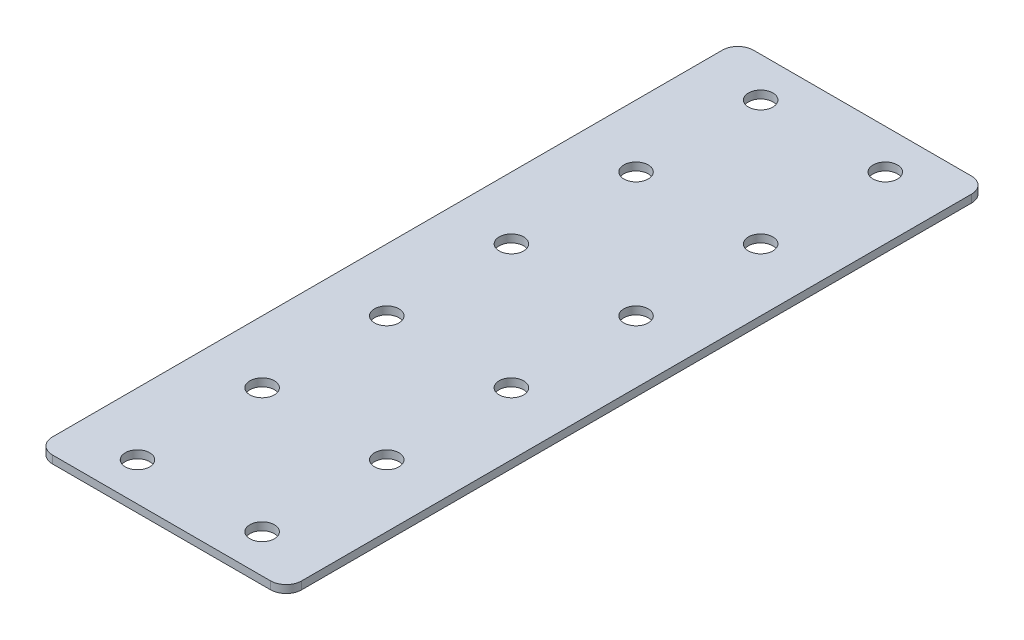
ISO-10303-21;
HEADER;
FILE_DESCRIPTION(('STEP AP214'),'2;1');
FILE_NAME('part.step','',(''),(''),'','','');
FILE_SCHEMA(('AUTOMOTIVE_DESIGN { 1 0 10303 214 1 1 1 1 }'));
ENDSEC;
DATA;
#1=APPLICATION_CONTEXT('core data for automotive mechanical design processes');
#2=APPLICATION_PROTOCOL_DEFINITION('international standard','automotive_design',2000,#1);
#3=PRODUCT_CONTEXT('',#1,'mechanical');
#4=PRODUCT('Part','Part','',(#3));
#5=PRODUCT_RELATED_PRODUCT_CATEGORY('part','',(#4));
#6=PRODUCT_DEFINITION_FORMATION('','',#4);
#7=PRODUCT_DEFINITION_CONTEXT('part definition',#1,'design');
#8=PRODUCT_DEFINITION('design','',#6,#7);
#9=PRODUCT_DEFINITION_SHAPE('','',#8);
#10=(LENGTH_UNIT() NAMED_UNIT(*) SI_UNIT(.MILLI.,.METRE.));
#11=(NAMED_UNIT(*) PLANE_ANGLE_UNIT() SI_UNIT($,.RADIAN.));
#12=(NAMED_UNIT(*) SI_UNIT($,.STERADIAN.) SOLID_ANGLE_UNIT());
#13=UNCERTAINTY_MEASURE_WITH_UNIT(LENGTH_MEASURE(1.E-05),#10,'distance_accuracy_value','');
#14=(GEOMETRIC_REPRESENTATION_CONTEXT(3) GLOBAL_UNCERTAINTY_ASSIGNED_CONTEXT((#13)) GLOBAL_UNIT_ASSIGNED_CONTEXT((#10,
#11,#12)) REPRESENTATION_CONTEXT('',''));
#15=CARTESIAN_POINT('',(0.,0.,0.));
#16=DIRECTION('',(0.,0.,1.));
#17=DIRECTION('',(1.,0.,0.));
#18=AXIS2_PLACEMENT_3D('',#15,#16,#17);
#19=CARTESIAN_POINT('',(0.,1.5875,0.));
#20=DIRECTION('',(0.,-1.,0.));
#21=DIRECTION('',(0.,0.,-1.));
#22=AXIS2_PLACEMENT_3D('',#19,#20,#21);
#23=PLANE('',#22);
#24=DIRECTION('',(-1.,0.,0.));
#25=VECTOR('',#24,1.);
#26=CARTESIAN_POINT('',(0.,1.5875,-142.875));
#27=LINE('',#26,#25);
#28=CARTESIAN_POINT('',(47.625,1.5875,-142.875));
#29=VERTEX_POINT('',#28);
#30=CARTESIAN_POINT('',(3.175,1.5875,-142.875));
#31=VERTEX_POINT('',#30);
#32=EDGE_CURVE('E142',#29,#31,#27,.T.);
#33=ORIENTED_EDGE('',*,*,#32,.T.);
#34=CARTESIAN_POINT('',(3.175,1.5875,-139.7));
#35=DIRECTION('',(0.,-1.,0.));
#36=DIRECTION('',(0.,0.,-1.));
#37=AXIS2_PLACEMENT_3D('',#34,#35,#36);
#38=CIRCLE('',#37,3.175);
#39=CARTESIAN_POINT('',(0.,1.5875,-139.7));
#40=VERTEX_POINT('',#39);
#41=EDGE_CURVE('E160',#31,#40,#38,.F.);
#42=ORIENTED_EDGE('',*,*,#41,.T.);
#43=DIRECTION('',(0.,0.,1.));
#44=VECTOR('',#43,1.);
#45=CARTESIAN_POINT('',(0.,1.5875,0.));
#46=LINE('',#45,#44);
#47=CARTESIAN_POINT('',(0.,1.5875,-3.175));
#48=VERTEX_POINT('',#47);
#49=EDGE_CURVE('E124',#40,#48,#46,.T.);
#50=ORIENTED_EDGE('',*,*,#49,.T.);
#51=CARTESIAN_POINT('',(3.175,1.5875,-3.175));
#52=DIRECTION('',(0.,-1.,0.));
#53=DIRECTION('',(0.,0.,-1.));
#54=AXIS2_PLACEMENT_3D('',#51,#52,#53);
#55=CIRCLE('',#54,3.175);
#56=CARTESIAN_POINT('',(3.175,1.5875,0.));
#57=VERTEX_POINT('',#56);
#58=EDGE_CURVE('E156',#48,#57,#55,.F.);
#59=ORIENTED_EDGE('',*,*,#58,.T.);
#60=DIRECTION('',(1.,0.,0.));
#61=VECTOR('',#60,1.);
#62=CARTESIAN_POINT('',(0.,1.5875,0.));
#63=LINE('',#62,#61);
#64=CARTESIAN_POINT('',(47.625,1.5875,0.));
#65=VERTEX_POINT('',#64);
#66=EDGE_CURVE('E169',#57,#65,#63,.T.);
#67=ORIENTED_EDGE('',*,*,#66,.T.);
#68=CARTESIAN_POINT('',(47.625,1.5875,-3.175));
#69=DIRECTION('',(0.,-1.,0.));
#70=DIRECTION('',(0.,0.,-1.));
#71=AXIS2_PLACEMENT_3D('',#68,#69,#70);
#72=CIRCLE('',#71,3.175);
#73=CARTESIAN_POINT('',(50.8,1.5875,-3.175));
#74=VERTEX_POINT('',#73);
#75=EDGE_CURVE('E59',#65,#74,#72,.F.);
#76=ORIENTED_EDGE('',*,*,#75,.T.);
#77=DIRECTION('',(0.,0.,-1.));
#78=VECTOR('',#77,1.);
#79=CARTESIAN_POINT('',(50.8,1.5875,0.));
#80=LINE('',#79,#78);
#81=CARTESIAN_POINT('',(50.8,1.5875,-139.7));
#82=VERTEX_POINT('',#81);
#83=EDGE_CURVE('E175',#74,#82,#80,.T.);
#84=ORIENTED_EDGE('',*,*,#83,.T.);
#85=CARTESIAN_POINT('',(47.625,1.5875,-139.7));
#86=DIRECTION('',(0.,-1.,0.));
#87=DIRECTION('',(0.,0.,-1.));
#88=AXIS2_PLACEMENT_3D('',#85,#86,#87);
#89=CIRCLE('',#88,3.175);
#90=EDGE_CURVE('E158',#82,#29,#89,.F.);
#91=ORIENTED_EDGE('',*,*,#90,.T.);
#92=EDGE_LOOP('',(#33,#42,#50,#59,#67,#76,#84,#91));
#93=FACE_BOUND('',#92,.T.);
#94=CARTESIAN_POINT('',(12.7,1.5875,-7.813330322));
#95=DIRECTION('',(0.,1.,0.));
#96=DIRECTION('',(0.,0.,1.));
#97=AXIS2_PLACEMENT_3D('',#94,#95,#96);
#98=CIRCLE('',#97,2.4892);
#99=CARTESIAN_POINT('',(12.7,1.5875,-5.324130322));
#100=VERTEX_POINT('',#99);
#101=EDGE_CURVE('E133',#100,#100,#98,.T.);
#102=ORIENTED_EDGE('',*,*,#101,.F.);
#103=EDGE_LOOP('',(#102));
#104=FACE_BOUND('',#103,.T.);
#105=CARTESIAN_POINT('',(12.7,1.5875,-33.213330322));
#106=DIRECTION('',(0.,1.,0.));
#107=DIRECTION('',(0.,0.,1.));
#108=AXIS2_PLACEMENT_3D('',#105,#106,#107);
#109=CIRCLE('',#108,2.4892);
#110=CARTESIAN_POINT('',(12.7,1.5875,-30.724130322));
#111=VERTEX_POINT('',#110);
#112=EDGE_CURVE('E190',#111,#111,#109,.T.);
#113=ORIENTED_EDGE('',*,*,#112,.F.);
#114=EDGE_LOOP('',(#113));
#115=FACE_BOUND('',#114,.T.);
#116=CARTESIAN_POINT('',(12.7,1.5875,-58.613330322));
#117=DIRECTION('',(0.,1.,0.));
#118=DIRECTION('',(0.,0.,1.));
#119=AXIS2_PLACEMENT_3D('',#116,#117,#118);
#120=CIRCLE('',#119,2.4892);
#121=CARTESIAN_POINT('',(12.7,1.5875,-56.124130322));
#122=VERTEX_POINT('',#121);
#123=EDGE_CURVE('E195',#122,#122,#120,.T.);
#124=ORIENTED_EDGE('',*,*,#123,.F.);
#125=EDGE_LOOP('',(#124));
#126=FACE_BOUND('',#125,.T.);
#127=CARTESIAN_POINT('',(12.7,1.5875,-84.013330322));
#128=DIRECTION('',(0.,1.,0.));
#129=DIRECTION('',(0.,0.,1.));
#130=AXIS2_PLACEMENT_3D('',#127,#128,#129);
#131=CIRCLE('',#130,2.4892);
#132=CARTESIAN_POINT('',(12.7,1.5875,-81.524130322));
#133=VERTEX_POINT('',#132);
#134=EDGE_CURVE('E201',#133,#133,#131,.T.);
#135=ORIENTED_EDGE('',*,*,#134,.F.);
#136=EDGE_LOOP('',(#135));
#137=FACE_BOUND('',#136,.T.);
#138=CARTESIAN_POINT('',(12.7,1.5875,-109.413330322));
#139=DIRECTION('',(0.,1.,0.));
#140=DIRECTION('',(0.,0.,1.));
#141=AXIS2_PLACEMENT_3D('',#138,#139,#140);
#142=CIRCLE('',#141,2.4892);
#143=CARTESIAN_POINT('',(12.7,1.5875,-106.924130322));
#144=VERTEX_POINT('',#143);
#145=EDGE_CURVE('E207',#144,#144,#142,.T.);
#146=ORIENTED_EDGE('',*,*,#145,.F.);
#147=EDGE_LOOP('',(#146));
#148=FACE_BOUND('',#147,.T.);
#149=CARTESIAN_POINT('',(12.7,1.5875,-134.813330322));
#150=DIRECTION('',(0.,1.,0.));
#151=DIRECTION('',(0.,0.,1.));
#152=AXIS2_PLACEMENT_3D('',#149,#150,#151);
#153=CIRCLE('',#152,2.4892);
#154=CARTESIAN_POINT('',(12.7,1.5875,-132.324130322));
#155=VERTEX_POINT('',#154);
#156=EDGE_CURVE('E213',#155,#155,#153,.T.);
#157=ORIENTED_EDGE('',*,*,#156,.F.);
#158=EDGE_LOOP('',(#157));
#159=FACE_BOUND('',#158,.T.);
#160=CARTESIAN_POINT('',(38.1,1.5875,-33.213330322));
#161=DIRECTION('',(0.,1.,0.));
#162=DIRECTION('',(0.,0.,1.));
#163=AXIS2_PLACEMENT_3D('',#160,#161,#162);
#164=CIRCLE('',#163,2.4892);
#165=CARTESIAN_POINT('',(38.1,1.5875,-30.724130322));
#166=VERTEX_POINT('',#165);
#167=EDGE_CURVE('E219',#166,#166,#164,.T.);
#168=ORIENTED_EDGE('',*,*,#167,.F.);
#169=EDGE_LOOP('',(#168));
#170=FACE_BOUND('',#169,.T.);
#171=CARTESIAN_POINT('',(38.1,1.5875,-58.613330322));
#172=DIRECTION('',(0.,1.,0.));
#173=DIRECTION('',(0.,0.,1.));
#174=AXIS2_PLACEMENT_3D('',#171,#172,#173);
#175=CIRCLE('',#174,2.4892);
#176=CARTESIAN_POINT('',(38.1,1.5875,-56.124130322));
#177=VERTEX_POINT('',#176);
#178=EDGE_CURVE('E225',#177,#177,#175,.T.);
#179=ORIENTED_EDGE('',*,*,#178,.F.);
#180=EDGE_LOOP('',(#179));
#181=FACE_BOUND('',#180,.T.);
#182=CARTESIAN_POINT('',(38.1,1.5875,-84.013330322));
#183=DIRECTION('',(0.,1.,0.));
#184=DIRECTION('',(0.,0.,1.));
#185=AXIS2_PLACEMENT_3D('',#182,#183,#184);
#186=CIRCLE('',#185,2.4892);
#187=CARTESIAN_POINT('',(38.1,1.5875,-81.524130322));
#188=VERTEX_POINT('',#187);
#189=EDGE_CURVE('E231',#188,#188,#186,.T.);
#190=ORIENTED_EDGE('',*,*,#189,.F.);
#191=EDGE_LOOP('',(#190));
#192=FACE_BOUND('',#191,.T.);
#193=CARTESIAN_POINT('',(38.1,1.5875,-109.413330322));
#194=DIRECTION('',(0.,1.,0.));
#195=DIRECTION('',(0.,0.,1.));
#196=AXIS2_PLACEMENT_3D('',#193,#194,#195);
#197=CIRCLE('',#196,2.4892);
#198=CARTESIAN_POINT('',(38.1,1.5875,-106.924130322));
#199=VERTEX_POINT('',#198);
#200=EDGE_CURVE('E237',#199,#199,#197,.T.);
#201=ORIENTED_EDGE('',*,*,#200,.F.);
#202=EDGE_LOOP('',(#201));
#203=FACE_BOUND('',#202,.T.);
#204=CARTESIAN_POINT('',(38.1,1.5875,-134.813330322));
#205=DIRECTION('',(0.,1.,0.));
#206=DIRECTION('',(0.,0.,1.));
#207=AXIS2_PLACEMENT_3D('',#204,#205,#206);
#208=CIRCLE('',#207,2.48920000000001);
#209=CARTESIAN_POINT('',(38.1,1.5875,-132.324130322));
#210=VERTEX_POINT('',#209);
#211=EDGE_CURVE('E243',#210,#210,#208,.T.);
#212=ORIENTED_EDGE('',*,*,#211,.F.);
#213=EDGE_LOOP('',(#212));
#214=FACE_BOUND('',#213,.T.);
#215=CARTESIAN_POINT('',(38.1,1.5875,-7.813330322));
#216=DIRECTION('',(0.,1.,0.));
#217=DIRECTION('',(0.,0.,1.));
#218=AXIS2_PLACEMENT_3D('',#215,#216,#217);
#219=CIRCLE('',#218,2.4892);
#220=CARTESIAN_POINT('',(38.1,1.5875,-5.324130322));
#221=VERTEX_POINT('',#220);
#222=EDGE_CURVE('E249',#221,#221,#219,.T.);
#223=ORIENTED_EDGE('',*,*,#222,.F.);
#224=EDGE_LOOP('',(#223));
#225=FACE_BOUND('',#224,.T.);
#226=ADVANCED_FACE('F37',(#93,#104,#115,#126,#137,#148,#159,#170,#181,#192,#203,#214,#225),#23,.F.);
#227=CARTESIAN_POINT('',(0.,0.,0.));
#228=DIRECTION('',(0.,-1.,0.));
#229=DIRECTION('',(0.,0.,-1.));
#230=AXIS2_PLACEMENT_3D('',#227,#228,#229);
#231=PLANE('',#230);
#232=CARTESIAN_POINT('',(38.1,0.,-134.813330322));
#233=DIRECTION('',(0.,1.,0.));
#234=DIRECTION('',(0.,0.,1.));
#235=AXIS2_PLACEMENT_3D('',#232,#233,#234);
#236=CIRCLE('',#235,2.48920000000001);
#237=CARTESIAN_POINT('',(38.1,0.,-132.324130322));
#238=VERTEX_POINT('',#237);
#239=EDGE_CURVE('E246',#238,#238,#236,.T.);
#240=ORIENTED_EDGE('',*,*,#239,.T.);
#241=EDGE_LOOP('',(#240));
#242=FACE_BOUND('',#241,.T.);
#243=CARTESIAN_POINT('',(38.1,0.,-84.013330322));
#244=DIRECTION('',(0.,1.,0.));
#245=DIRECTION('',(0.,0.,1.));
#246=AXIS2_PLACEMENT_3D('',#243,#244,#245);
#247=CIRCLE('',#246,2.4892);
#248=CARTESIAN_POINT('',(38.1,0.,-81.524130322));
#249=VERTEX_POINT('',#248);
#250=EDGE_CURVE('E234',#249,#249,#247,.T.);
#251=ORIENTED_EDGE('',*,*,#250,.T.);
#252=EDGE_LOOP('',(#251));
#253=FACE_BOUND('',#252,.T.);
#254=CARTESIAN_POINT('',(38.1,0.,-33.213330322));
#255=DIRECTION('',(0.,1.,0.));
#256=DIRECTION('',(0.,0.,1.));
#257=AXIS2_PLACEMENT_3D('',#254,#255,#256);
#258=CIRCLE('',#257,2.4892);
#259=CARTESIAN_POINT('',(38.1,0.,-30.724130322));
#260=VERTEX_POINT('',#259);
#261=EDGE_CURVE('E222',#260,#260,#258,.T.);
#262=ORIENTED_EDGE('',*,*,#261,.T.);
#263=EDGE_LOOP('',(#262));
#264=FACE_BOUND('',#263,.T.);
#265=CARTESIAN_POINT('',(12.7,0.,-109.413330322));
#266=DIRECTION('',(0.,1.,0.));
#267=DIRECTION('',(0.,0.,1.));
#268=AXIS2_PLACEMENT_3D('',#265,#266,#267);
#269=CIRCLE('',#268,2.4892);
#270=CARTESIAN_POINT('',(12.7,0.,-106.924130322));
#271=VERTEX_POINT('',#270);
#272=EDGE_CURVE('E210',#271,#271,#269,.T.);
#273=ORIENTED_EDGE('',*,*,#272,.T.);
#274=EDGE_LOOP('',(#273));
#275=FACE_BOUND('',#274,.T.);
#276=CARTESIAN_POINT('',(12.7,0.,-58.613330322));
#277=DIRECTION('',(0.,1.,0.));
#278=DIRECTION('',(0.,0.,1.));
#279=AXIS2_PLACEMENT_3D('',#276,#277,#278);
#280=CIRCLE('',#279,2.4892);
#281=CARTESIAN_POINT('',(12.7,0.,-56.124130322));
#282=VERTEX_POINT('',#281);
#283=EDGE_CURVE('E198',#282,#282,#280,.T.);
#284=ORIENTED_EDGE('',*,*,#283,.T.);
#285=EDGE_LOOP('',(#284));
#286=FACE_BOUND('',#285,.T.);
#287=CARTESIAN_POINT('',(12.7,0.,-7.813330322));
#288=DIRECTION('',(0.,1.,0.));
#289=DIRECTION('',(0.,0.,1.));
#290=AXIS2_PLACEMENT_3D('',#287,#288,#289);
#291=CIRCLE('',#290,2.4892);
#292=CARTESIAN_POINT('',(12.7,0.,-5.324130322));
#293=VERTEX_POINT('',#292);
#294=EDGE_CURVE('E139',#293,#293,#291,.T.);
#295=ORIENTED_EDGE('',*,*,#294,.T.);
#296=EDGE_LOOP('',(#295));
#297=FACE_BOUND('',#296,.T.);
#298=DIRECTION('',(0.,0.,1.));
#299=VECTOR('',#298,1.);
#300=CARTESIAN_POINT('',(0.,0.,0.));
#301=LINE('',#300,#299);
#302=CARTESIAN_POINT('',(0.,0.,-139.7));
#303=VERTEX_POINT('',#302);
#304=CARTESIAN_POINT('',(0.,0.,-3.175));
#305=VERTEX_POINT('',#304);
#306=EDGE_CURVE('E121',#303,#305,#301,.T.);
#307=ORIENTED_EDGE('',*,*,#306,.F.);
#308=CARTESIAN_POINT('',(3.175,0.,-139.7));
#309=DIRECTION('',(0.,-1.,0.));
#310=DIRECTION('',(0.,0.,-1.));
#311=AXIS2_PLACEMENT_3D('',#308,#309,#310);
#312=CIRCLE('',#311,3.175);
#313=CARTESIAN_POINT('',(3.175,0.,-142.875));
#314=VERTEX_POINT('',#313);
#315=EDGE_CURVE('E104',#303,#314,#312,.T.);
#316=ORIENTED_EDGE('',*,*,#315,.T.);
#317=DIRECTION('',(-1.,0.,0.));
#318=VECTOR('',#317,1.);
#319=CARTESIAN_POINT('',(0.,0.,-142.875));
#320=LINE('',#319,#318);
#321=CARTESIAN_POINT('',(47.625,0.,-142.875));
#322=VERTEX_POINT('',#321);
#323=EDGE_CURVE('E146',#322,#314,#320,.T.);
#324=ORIENTED_EDGE('',*,*,#323,.F.);
#325=CARTESIAN_POINT('',(47.625,0.,-139.7));
#326=DIRECTION('',(0.,-1.,0.));
#327=DIRECTION('',(0.,0.,-1.));
#328=AXIS2_PLACEMENT_3D('',#325,#326,#327);
#329=CIRCLE('',#328,3.175);
#330=CARTESIAN_POINT('',(50.8,0.,-139.7));
#331=VERTEX_POINT('',#330);
#332=EDGE_CURVE('E115',#322,#331,#329,.T.);
#333=ORIENTED_EDGE('',*,*,#332,.T.);
#334=DIRECTION('',(0.,0.,-1.));
#335=VECTOR('',#334,1.);
#336=CARTESIAN_POINT('',(50.8,0.,0.));
#337=LINE('',#336,#335);
#338=CARTESIAN_POINT('',(50.8,0.,-3.175));
#339=VERTEX_POINT('',#338);
#340=EDGE_CURVE('E136',#339,#331,#337,.T.);
#341=ORIENTED_EDGE('',*,*,#340,.F.);
#342=CARTESIAN_POINT('',(47.625,0.,-3.175));
#343=DIRECTION('',(0.,-1.,0.));
#344=DIRECTION('',(0.,0.,-1.));
#345=AXIS2_PLACEMENT_3D('',#342,#343,#344);
#346=CIRCLE('',#345,3.175);
#347=CARTESIAN_POINT('',(47.625,0.,0.));
#348=VERTEX_POINT('',#347);
#349=EDGE_CURVE('E125',#339,#348,#346,.T.);
#350=ORIENTED_EDGE('',*,*,#349,.T.);
#351=DIRECTION('',(1.,0.,0.));
#352=VECTOR('',#351,1.);
#353=CARTESIAN_POINT('',(0.,0.,0.));
#354=LINE('',#353,#352);
#355=CARTESIAN_POINT('',(3.175,0.,0.));
#356=VERTEX_POINT('',#355);
#357=EDGE_CURVE('E132',#356,#348,#354,.T.);
#358=ORIENTED_EDGE('',*,*,#357,.F.);
#359=CARTESIAN_POINT('',(3.175,0.,-3.175));
#360=DIRECTION('',(0.,-1.,0.));
#361=DIRECTION('',(0.,0.,-1.));
#362=AXIS2_PLACEMENT_3D('',#359,#360,#361);
#363=CIRCLE('',#362,3.175);
#364=EDGE_CURVE('E131',#356,#305,#363,.T.);
#365=ORIENTED_EDGE('',*,*,#364,.T.);
#366=EDGE_LOOP('',(#307,#316,#324,#333,#341,#350,#358,#365));
#367=FACE_BOUND('',#366,.T.);
#368=CARTESIAN_POINT('',(12.7,0.,-33.213330322));
#369=DIRECTION('',(0.,1.,0.));
#370=DIRECTION('',(0.,0.,1.));
#371=AXIS2_PLACEMENT_3D('',#368,#369,#370);
#372=CIRCLE('',#371,2.4892);
#373=CARTESIAN_POINT('',(12.7,0.,-30.724130322));
#374=VERTEX_POINT('',#373);
#375=EDGE_CURVE('E192',#374,#374,#372,.T.);
#376=ORIENTED_EDGE('',*,*,#375,.T.);
#377=EDGE_LOOP('',(#376));
#378=FACE_BOUND('',#377,.T.);
#379=CARTESIAN_POINT('',(12.7,0.,-84.013330322));
#380=DIRECTION('',(0.,1.,0.));
#381=DIRECTION('',(0.,0.,1.));
#382=AXIS2_PLACEMENT_3D('',#379,#380,#381);
#383=CIRCLE('',#382,2.4892);
#384=CARTESIAN_POINT('',(12.7,0.,-81.524130322));
#385=VERTEX_POINT('',#384);
#386=EDGE_CURVE('E204',#385,#385,#383,.T.);
#387=ORIENTED_EDGE('',*,*,#386,.T.);
#388=EDGE_LOOP('',(#387));
#389=FACE_BOUND('',#388,.T.);
#390=CARTESIAN_POINT('',(12.7,0.,-134.813330322));
#391=DIRECTION('',(0.,1.,0.));
#392=DIRECTION('',(0.,0.,1.));
#393=AXIS2_PLACEMENT_3D('',#390,#391,#392);
#394=CIRCLE('',#393,2.4892);
#395=CARTESIAN_POINT('',(12.7,0.,-132.324130322));
#396=VERTEX_POINT('',#395);
#397=EDGE_CURVE('E216',#396,#396,#394,.T.);
#398=ORIENTED_EDGE('',*,*,#397,.T.);
#399=EDGE_LOOP('',(#398));
#400=FACE_BOUND('',#399,.T.);
#401=CARTESIAN_POINT('',(38.1,0.,-58.613330322));
#402=DIRECTION('',(0.,1.,0.));
#403=DIRECTION('',(0.,0.,1.));
#404=AXIS2_PLACEMENT_3D('',#401,#402,#403);
#405=CIRCLE('',#404,2.4892);
#406=CARTESIAN_POINT('',(38.1,0.,-56.124130322));
#407=VERTEX_POINT('',#406);
#408=EDGE_CURVE('E228',#407,#407,#405,.T.);
#409=ORIENTED_EDGE('',*,*,#408,.T.);
#410=EDGE_LOOP('',(#409));
#411=FACE_BOUND('',#410,.T.);
#412=CARTESIAN_POINT('',(38.1,0.,-109.413330322));
#413=DIRECTION('',(0.,1.,0.));
#414=DIRECTION('',(0.,0.,1.));
#415=AXIS2_PLACEMENT_3D('',#412,#413,#414);
#416=CIRCLE('',#415,2.4892);
#417=CARTESIAN_POINT('',(38.1,0.,-106.924130322));
#418=VERTEX_POINT('',#417);
#419=EDGE_CURVE('E240',#418,#418,#416,.T.);
#420=ORIENTED_EDGE('',*,*,#419,.T.);
#421=EDGE_LOOP('',(#420));
#422=FACE_BOUND('',#421,.T.);
#423=CARTESIAN_POINT('',(38.1,0.,-7.813330322));
#424=DIRECTION('',(0.,1.,0.));
#425=DIRECTION('',(0.,0.,1.));
#426=AXIS2_PLACEMENT_3D('',#423,#424,#425);
#427=CIRCLE('',#426,2.4892);
#428=CARTESIAN_POINT('',(38.1,0.,-5.324130322));
#429=VERTEX_POINT('',#428);
#430=EDGE_CURVE('E252',#429,#429,#427,.T.);
#431=ORIENTED_EDGE('',*,*,#430,.T.);
#432=EDGE_LOOP('',(#431));
#433=FACE_BOUND('',#432,.T.);
#434=ADVANCED_FACE('F128',(#242,#253,#264,#275,#286,#297,#367,#378,#389,#400,#411,#422,#433),
#231,.T.);
#435=CARTESIAN_POINT('',(0.,1.5875,0.));
#436=DIRECTION('',(1.,0.,0.));
#437=DIRECTION('',(0.,0.,-1.));
#438=AXIS2_PLACEMENT_3D('',#435,#436,#437);
#439=PLANE('',#438);
#440=ORIENTED_EDGE('',*,*,#49,.F.);
#441=DIRECTION('',(0.,-1.,0.));
#442=VECTOR('',#441,1.);
#443=CARTESIAN_POINT('',(0.,1.5875,-139.7));
#444=LINE('',#443,#442);
#445=EDGE_CURVE('E108',#40,#303,#444,.T.);
#446=ORIENTED_EDGE('',*,*,#445,.T.);
#447=ORIENTED_EDGE('',*,*,#306,.T.);
#448=DIRECTION('',(0.,-1.,0.));
#449=VECTOR('',#448,1.);
#450=CARTESIAN_POINT('',(0.,1.5875,-3.175));
#451=LINE('',#450,#449);
#452=EDGE_CURVE('E126',#305,#48,#451,.F.);
#453=ORIENTED_EDGE('',*,*,#452,.T.);
#454=EDGE_LOOP('',(#440,#446,#447,#453));
#455=FACE_BOUND('',#454,.T.);
#456=ADVANCED_FACE('F120',(#455),#439,.F.);
#457=CARTESIAN_POINT('',(0.,1.5875,0.));
#458=DIRECTION('',(0.,0.,-1.));
#459=DIRECTION('',(-1.,0.,0.));
#460=AXIS2_PLACEMENT_3D('',#457,#458,#459);
#461=PLANE('',#460);
#462=ORIENTED_EDGE('',*,*,#66,.F.);
#463=DIRECTION('',(0.,-1.,0.));
#464=VECTOR('',#463,1.);
#465=CARTESIAN_POINT('',(3.175,1.5875,0.));
#466=LINE('',#465,#464);
#467=EDGE_CURVE('E11',#57,#356,#466,.T.);
#468=ORIENTED_EDGE('',*,*,#467,.T.);
#469=ORIENTED_EDGE('',*,*,#357,.T.);
#470=DIRECTION('',(0.,-1.,0.));
#471=VECTOR('',#470,1.);
#472=CARTESIAN_POINT('',(47.625,1.5875,0.));
#473=LINE('',#472,#471);
#474=EDGE_CURVE('E45',#348,#65,#473,.F.);
#475=ORIENTED_EDGE('',*,*,#474,.T.);
#476=EDGE_LOOP('',(#462,#468,#469,#475));
#477=FACE_BOUND('',#476,.T.);
#478=ADVANCED_FACE('F168',(#477),#461,.F.);
#479=CARTESIAN_POINT('',(50.8,1.5875,0.));
#480=DIRECTION('',(-1.,0.,0.));
#481=DIRECTION('',(0.,0.,1.));
#482=AXIS2_PLACEMENT_3D('',#479,#480,#481);
#483=PLANE('',#482);
#484=ORIENTED_EDGE('',*,*,#340,.T.);
#485=DIRECTION('',(0.,-1.,0.));
#486=VECTOR('',#485,1.);
#487=CARTESIAN_POINT('',(50.8,1.5875,-139.7));
#488=LINE('',#487,#486);
#489=EDGE_CURVE('E52',#331,#82,#488,.F.);
#490=ORIENTED_EDGE('',*,*,#489,.T.);
#491=ORIENTED_EDGE('',*,*,#83,.F.);
#492=DIRECTION('',(0.,-1.,0.));
#493=VECTOR('',#492,1.);
#494=CARTESIAN_POINT('',(50.8,1.5875,-3.175));
#495=LINE('',#494,#493);
#496=EDGE_CURVE('E162',#74,#339,#495,.T.);
#497=ORIENTED_EDGE('',*,*,#496,.T.);
#498=EDGE_LOOP('',(#484,#490,#491,#497));
#499=FACE_BOUND('',#498,.T.);
#500=ADVANCED_FACE('F179',(#499),#483,.F.);
#501=CARTESIAN_POINT('',(0.,1.5875,-142.875));
#502=DIRECTION('',(0.,0.,1.));
#503=DIRECTION('',(1.,0.,0.));
#504=AXIS2_PLACEMENT_3D('',#501,#502,#503);
#505=PLANE('',#504);
#506=ORIENTED_EDGE('',*,*,#323,.T.);
#507=DIRECTION('',(0.,-1.,0.));
#508=VECTOR('',#507,1.);
#509=CARTESIAN_POINT('',(3.175,1.5875,-142.875));
#510=LINE('',#509,#508);
#511=EDGE_CURVE('E109',#314,#31,#510,.F.);
#512=ORIENTED_EDGE('',*,*,#511,.T.);
#513=ORIENTED_EDGE('',*,*,#32,.F.);
#514=DIRECTION('',(0.,-1.,0.));
#515=VECTOR('',#514,1.);
#516=CARTESIAN_POINT('',(47.625,1.5875,-142.875));
#517=LINE('',#516,#515);
#518=EDGE_CURVE('E114',#29,#322,#517,.T.);
#519=ORIENTED_EDGE('',*,*,#518,.T.);
#520=EDGE_LOOP('',(#506,#512,#513,#519));
#521=FACE_BOUND('',#520,.T.);
#522=ADVANCED_FACE('F186',(#521),#505,.F.);
#523=CARTESIAN_POINT('',(12.7,1.5875,-7.813330322));
#524=DIRECTION('',(0.,-1.,0.));
#525=DIRECTION('',(0.,0.,-1.));
#526=AXIS2_PLACEMENT_3D('',#523,#524,#525);
#527=CYLINDRICAL_SURFACE('',#526,2.4892);
#528=ORIENTED_EDGE('',*,*,#101,.T.);
#529=EDGE_LOOP('',(#528));
#530=FACE_BOUND('',#529,.T.);
#531=ORIENTED_EDGE('',*,*,#294,.F.);
#532=EDGE_LOOP('',(#531));
#533=FACE_BOUND('',#532,.T.);
#534=ADVANCED_FACE('F269',(#530,#533),#527,.F.);
#535=CARTESIAN_POINT('',(12.7,1.5875,-33.213330322));
#536=DIRECTION('',(0.,-1.,0.));
#537=DIRECTION('',(0.,0.,-1.));
#538=AXIS2_PLACEMENT_3D('',#535,#536,#537);
#539=CYLINDRICAL_SURFACE('',#538,2.4892);
#540=ORIENTED_EDGE('',*,*,#112,.T.);
#541=EDGE_LOOP('',(#540));
#542=FACE_BOUND('',#541,.T.);
#543=ORIENTED_EDGE('',*,*,#375,.F.);
#544=EDGE_LOOP('',(#543));
#545=FACE_BOUND('',#544,.T.);
#546=ADVANCED_FACE('F460',(#542,#545),#539,.F.);
#547=CARTESIAN_POINT('',(12.7,1.5875,-58.613330322));
#548=DIRECTION('',(0.,-1.,0.));
#549=DIRECTION('',(0.,0.,-1.));
#550=AXIS2_PLACEMENT_3D('',#547,#548,#549);
#551=CYLINDRICAL_SURFACE('',#550,2.4892);
#552=ORIENTED_EDGE('',*,*,#123,.T.);
#553=EDGE_LOOP('',(#552));
#554=FACE_BOUND('',#553,.T.);
#555=ORIENTED_EDGE('',*,*,#283,.F.);
#556=EDGE_LOOP('',(#555));
#557=FACE_BOUND('',#556,.T.);
#558=ADVANCED_FACE('F449',(#554,#557),#551,.F.);
#559=CARTESIAN_POINT('',(12.7,1.5875,-84.013330322));
#560=DIRECTION('',(0.,-1.,0.));
#561=DIRECTION('',(0.,0.,-1.));
#562=AXIS2_PLACEMENT_3D('',#559,#560,#561);
#563=CYLINDRICAL_SURFACE('',#562,2.4892);
#564=ORIENTED_EDGE('',*,*,#134,.T.);
#565=EDGE_LOOP('',(#564));
#566=FACE_BOUND('',#565,.T.);
#567=ORIENTED_EDGE('',*,*,#386,.F.);
#568=EDGE_LOOP('',(#567));
#569=FACE_BOUND('',#568,.T.);
#570=ADVANCED_FACE('F438',(#566,#569),#563,.F.);
#571=CARTESIAN_POINT('',(12.7,1.5875,-109.413330322));
#572=DIRECTION('',(0.,-1.,0.));
#573=DIRECTION('',(0.,0.,-1.));
#574=AXIS2_PLACEMENT_3D('',#571,#572,#573);
#575=CYLINDRICAL_SURFACE('',#574,2.4892);
#576=ORIENTED_EDGE('',*,*,#145,.T.);
#577=EDGE_LOOP('',(#576));
#578=FACE_BOUND('',#577,.T.);
#579=ORIENTED_EDGE('',*,*,#272,.F.);
#580=EDGE_LOOP('',(#579));
#581=FACE_BOUND('',#580,.T.);
#582=ADVANCED_FACE('F427',(#578,#581),#575,.F.);
#583=CARTESIAN_POINT('',(12.7,1.5875,-134.813330322));
#584=DIRECTION('',(0.,-1.,0.));
#585=DIRECTION('',(0.,0.,-1.));
#586=AXIS2_PLACEMENT_3D('',#583,#584,#585);
#587=CYLINDRICAL_SURFACE('',#586,2.4892);
#588=ORIENTED_EDGE('',*,*,#156,.T.);
#589=EDGE_LOOP('',(#588));
#590=FACE_BOUND('',#589,.T.);
#591=ORIENTED_EDGE('',*,*,#397,.F.);
#592=EDGE_LOOP('',(#591));
#593=FACE_BOUND('',#592,.T.);
#594=ADVANCED_FACE('F416',(#590,#593),#587,.F.);
#595=CARTESIAN_POINT('',(38.1,1.5875,-33.213330322));
#596=DIRECTION('',(0.,-1.,0.));
#597=DIRECTION('',(0.,0.,-1.));
#598=AXIS2_PLACEMENT_3D('',#595,#596,#597);
#599=CYLINDRICAL_SURFACE('',#598,2.4892);
#600=ORIENTED_EDGE('',*,*,#167,.T.);
#601=EDGE_LOOP('',(#600));
#602=FACE_BOUND('',#601,.T.);
#603=ORIENTED_EDGE('',*,*,#261,.F.);
#604=EDGE_LOOP('',(#603));
#605=FACE_BOUND('',#604,.T.);
#606=ADVANCED_FACE('F405',(#602,#605),#599,.F.);
#607=CARTESIAN_POINT('',(38.1,1.5875,-58.613330322));
#608=DIRECTION('',(0.,-1.,0.));
#609=DIRECTION('',(0.,0.,-1.));
#610=AXIS2_PLACEMENT_3D('',#607,#608,#609);
#611=CYLINDRICAL_SURFACE('',#610,2.4892);
#612=ORIENTED_EDGE('',*,*,#178,.T.);
#613=EDGE_LOOP('',(#612));
#614=FACE_BOUND('',#613,.T.);
#615=ORIENTED_EDGE('',*,*,#408,.F.);
#616=EDGE_LOOP('',(#615));
#617=FACE_BOUND('',#616,.T.);
#618=ADVANCED_FACE('F394',(#614,#617),#611,.F.);
#619=CARTESIAN_POINT('',(38.1,1.5875,-84.013330322));
#620=DIRECTION('',(0.,-1.,0.));
#621=DIRECTION('',(0.,0.,-1.));
#622=AXIS2_PLACEMENT_3D('',#619,#620,#621);
#623=CYLINDRICAL_SURFACE('',#622,2.4892);
#624=ORIENTED_EDGE('',*,*,#189,.T.);
#625=EDGE_LOOP('',(#624));
#626=FACE_BOUND('',#625,.T.);
#627=ORIENTED_EDGE('',*,*,#250,.F.);
#628=EDGE_LOOP('',(#627));
#629=FACE_BOUND('',#628,.T.);
#630=ADVANCED_FACE('F383',(#626,#629),#623,.F.);
#631=CARTESIAN_POINT('',(38.1,1.5875,-109.413330322));
#632=DIRECTION('',(0.,-1.,0.));
#633=DIRECTION('',(0.,0.,-1.));
#634=AXIS2_PLACEMENT_3D('',#631,#632,#633);
#635=CYLINDRICAL_SURFACE('',#634,2.4892);
#636=ORIENTED_EDGE('',*,*,#200,.T.);
#637=EDGE_LOOP('',(#636));
#638=FACE_BOUND('',#637,.T.);
#639=ORIENTED_EDGE('',*,*,#419,.F.);
#640=EDGE_LOOP('',(#639));
#641=FACE_BOUND('',#640,.T.);
#642=ADVANCED_FACE('F372',(#638,#641),#635,.F.);
#643=CARTESIAN_POINT('',(38.1,1.5875,-134.813330322));
#644=DIRECTION('',(0.,-1.,0.));
#645=DIRECTION('',(0.,0.,-1.));
#646=AXIS2_PLACEMENT_3D('',#643,#644,#645);
#647=CYLINDRICAL_SURFACE('',#646,2.48920000000001);
#648=ORIENTED_EDGE('',*,*,#211,.T.);
#649=EDGE_LOOP('',(#648));
#650=FACE_BOUND('',#649,.T.);
#651=ORIENTED_EDGE('',*,*,#239,.F.);
#652=EDGE_LOOP('',(#651));
#653=FACE_BOUND('',#652,.T.);
#654=ADVANCED_FACE('F362',(#650,#653),#647,.F.);
#655=CARTESIAN_POINT('',(38.1,1.5875,-7.813330322));
#656=DIRECTION('',(0.,-1.,0.));
#657=DIRECTION('',(0.,0.,-1.));
#658=AXIS2_PLACEMENT_3D('',#655,#656,#657);
#659=CYLINDRICAL_SURFACE('',#658,2.4892);
#660=ORIENTED_EDGE('',*,*,#222,.T.);
#661=EDGE_LOOP('',(#660));
#662=FACE_BOUND('',#661,.T.);
#663=ORIENTED_EDGE('',*,*,#430,.F.);
#664=EDGE_LOOP('',(#663));
#665=FACE_BOUND('',#664,.T.);
#666=ADVANCED_FACE('F258',(#662,#665),#659,.F.);
#667=CARTESIAN_POINT('',(3.175,1.5875,-139.7));
#668=DIRECTION('',(0.,-1.,0.));
#669=DIRECTION('',(0.,0.,-1.));
#670=AXIS2_PLACEMENT_3D('',#667,#668,#669);
#671=CYLINDRICAL_SURFACE('',#670,3.175);
#672=ORIENTED_EDGE('',*,*,#41,.F.);
#673=ORIENTED_EDGE('',*,*,#511,.F.);
#674=ORIENTED_EDGE('',*,*,#315,.F.);
#675=ORIENTED_EDGE('',*,*,#445,.F.);
#676=EDGE_LOOP('',(#672,#673,#674,#675));
#677=FACE_BOUND('',#676,.T.);
#678=ADVANCED_FACE('F107',(#677),#671,.T.);
#679=CARTESIAN_POINT('',(47.625,1.5875,-139.7));
#680=DIRECTION('',(0.,-1.,0.));
#681=DIRECTION('',(0.,0.,-1.));
#682=AXIS2_PLACEMENT_3D('',#679,#680,#681);
#683=CYLINDRICAL_SURFACE('',#682,3.175);
#684=ORIENTED_EDGE('',*,*,#90,.F.);
#685=ORIENTED_EDGE('',*,*,#489,.F.);
#686=ORIENTED_EDGE('',*,*,#332,.F.);
#687=ORIENTED_EDGE('',*,*,#518,.F.);
#688=EDGE_LOOP('',(#684,#685,#686,#687));
#689=FACE_BOUND('',#688,.T.);
#690=ADVANCED_FACE('F183',(#689),#683,.T.);
#691=CARTESIAN_POINT('',(3.175,1.5875,-3.175));
#692=DIRECTION('',(0.,-1.,0.));
#693=DIRECTION('',(0.,0.,-1.));
#694=AXIS2_PLACEMENT_3D('',#691,#692,#693);
#695=CYLINDRICAL_SURFACE('',#694,3.175);
#696=ORIENTED_EDGE('',*,*,#58,.F.);
#697=ORIENTED_EDGE('',*,*,#452,.F.);
#698=ORIENTED_EDGE('',*,*,#364,.F.);
#699=ORIENTED_EDGE('',*,*,#467,.F.);
#700=EDGE_LOOP('',(#696,#697,#698,#699));
#701=FACE_BOUND('',#700,.T.);
#702=ADVANCED_FACE('F283',(#701),#695,.T.);
#703=CARTESIAN_POINT('',(47.625,1.5875,-3.175));
#704=DIRECTION('',(0.,-1.,0.));
#705=DIRECTION('',(0.,0.,-1.));
#706=AXIS2_PLACEMENT_3D('',#703,#704,#705);
#707=CYLINDRICAL_SURFACE('',#706,3.175);
#708=ORIENTED_EDGE('',*,*,#75,.F.);
#709=ORIENTED_EDGE('',*,*,#474,.F.);
#710=ORIENTED_EDGE('',*,*,#349,.F.);
#711=ORIENTED_EDGE('',*,*,#496,.F.);
#712=EDGE_LOOP('',(#708,#709,#710,#711));
#713=FACE_BOUND('',#712,.T.);
#714=ADVANCED_FACE('F39',(#713),#707,.T.);
#715=CLOSED_SHELL('',(#226,#434,#456,#478,#500,#522,#534,#546,#558,#570,#582,#594,#606,#618,
#630,#642,#654,#666,#678,#690,#702,#714));
#716=MANIFOLD_SOLID_BREP('B2',#715);
#717=ADVANCED_BREP_SHAPE_REPRESENTATION('',(#18,#716),#14);
#718=SHAPE_DEFINITION_REPRESENTATION(#9,#717);
ENDSEC;
END-ISO-10303-21;
